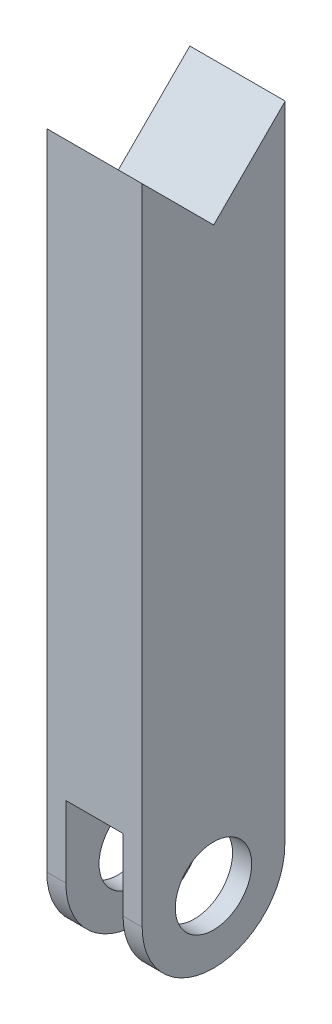
ISO-10303-21;
HEADER;
FILE_DESCRIPTION(('STEP AP214'),'2;1');
FILE_NAME('part.step','',(''),(''),'','','');
FILE_SCHEMA(('AUTOMOTIVE_DESIGN { 1 0 10303 214 1 1 1 1 }'));
ENDSEC;
DATA;
#1=APPLICATION_CONTEXT('core data for automotive mechanical design processes');
#2=APPLICATION_PROTOCOL_DEFINITION('international standard','automotive_design',2000,#1);
#3=PRODUCT_CONTEXT('',#1,'mechanical');
#4=PRODUCT('Part','Part','',(#3));
#5=PRODUCT_RELATED_PRODUCT_CATEGORY('part','',(#4));
#6=PRODUCT_DEFINITION_FORMATION('','',#4);
#7=PRODUCT_DEFINITION_CONTEXT('part definition',#1,'design');
#8=PRODUCT_DEFINITION('design','',#6,#7);
#9=PRODUCT_DEFINITION_SHAPE('','',#8);
#10=(LENGTH_UNIT() NAMED_UNIT(*) SI_UNIT(.MILLI.,.METRE.));
#11=(NAMED_UNIT(*) PLANE_ANGLE_UNIT() SI_UNIT($,.RADIAN.));
#12=(NAMED_UNIT(*) SI_UNIT($,.STERADIAN.) SOLID_ANGLE_UNIT());
#13=UNCERTAINTY_MEASURE_WITH_UNIT(LENGTH_MEASURE(1.E-05),#10,'distance_accuracy_value','');
#14=(GEOMETRIC_REPRESENTATION_CONTEXT(3) GLOBAL_UNCERTAINTY_ASSIGNED_CONTEXT((#13)) GLOBAL_UNIT_ASSIGNED_CONTEXT((#10,
#11,#12)) REPRESENTATION_CONTEXT('',''));
#15=CARTESIAN_POINT('',(0.,0.,0.));
#16=DIRECTION('',(0.,0.,1.));
#17=DIRECTION('',(1.,0.,0.));
#18=AXIS2_PLACEMENT_3D('',#15,#16,#17);
#19=CARTESIAN_POINT('',(100.,0.,0.));
#20=DIRECTION('',(-1.,0.,0.));
#21=DIRECTION('',(0.,0.,1.));
#22=AXIS2_PLACEMENT_3D('',#19,#20,#21);
#23=CYLINDRICAL_SURFACE('',#22,74.7678036336063);
#24=CARTESIAN_POINT('',(20.,0.,0.));
#25=DIRECTION('',(1.,0.,0.));
#26=DIRECTION('',(0.,0.,-1.));
#27=AXIS2_PLACEMENT_3D('',#24,#25,#26);
#28=CIRCLE('',#27,74.7678036336063);
#29=CARTESIAN_POINT('',(20.,0.,74.7678036336063));
#30=VERTEX_POINT('',#29);
#31=CARTESIAN_POINT('',(20.,0.,-74.7678036336063));
#32=VERTEX_POINT('',#31);
#33=EDGE_CURVE('E76',#30,#32,#28,.T.);
#34=ORIENTED_EDGE('',*,*,#33,.F.);
#35=DIRECTION('',(-1.,0.,0.));
#36=VECTOR('',#35,1.);
#37=CARTESIAN_POINT('',(100.,0.,74.7678036336063));
#38=LINE('',#37,#36);
#39=CARTESIAN_POINT('',(0.,0.,74.7678036336063));
#40=VERTEX_POINT('',#39);
#41=EDGE_CURVE('E72',#30,#40,#38,.T.);
#42=ORIENTED_EDGE('',*,*,#41,.T.);
#43=CARTESIAN_POINT('',(0.,0.,0.));
#44=DIRECTION('',(1.,0.,0.));
#45=DIRECTION('',(0.,0.,-1.));
#46=AXIS2_PLACEMENT_3D('',#43,#44,#45);
#47=CIRCLE('',#46,74.7678036336063);
#48=CARTESIAN_POINT('',(0.,0.,-74.7678036336063));
#49=VERTEX_POINT('',#48);
#50=EDGE_CURVE('E75',#40,#49,#47,.T.);
#51=ORIENTED_EDGE('',*,*,#50,.T.);
#52=DIRECTION('',(-1.,0.,0.));
#53=VECTOR('',#52,1.);
#54=CARTESIAN_POINT('',(100.,0.,-74.7678036336063));
#55=LINE('',#54,#53);
#56=EDGE_CURVE('E41',#32,#49,#55,.T.);
#57=ORIENTED_EDGE('',*,*,#56,.F.);
#58=EDGE_LOOP('',(#34,#42,#51,#57));
#59=FACE_BOUND('',#58,.T.);
#60=ADVANCED_FACE('F32',(#59),#23,.T.);
#61=CARTESIAN_POINT('',(285.,0.,0.));
#62=DIRECTION('',(-1.,0.,0.));
#63=DIRECTION('',(0.,0.,1.));
#64=AXIS2_PLACEMENT_3D('',#61,#62,#63);
#65=CYLINDRICAL_SURFACE('',#64,40.);
#66=CARTESIAN_POINT('',(0.,0.,0.));
#67=DIRECTION('',(-1.,0.,0.));
#68=DIRECTION('',(0.,0.,1.));
#69=AXIS2_PLACEMENT_3D('',#66,#67,#68);
#70=CIRCLE('',#69,40.);
#71=CARTESIAN_POINT('',(0.,0.,40.));
#72=VERTEX_POINT('',#71);
#73=EDGE_CURVE('E131',#72,#72,#70,.T.);
#74=ORIENTED_EDGE('',*,*,#73,.T.);
#75=EDGE_LOOP('',(#74));
#76=FACE_BOUND('',#75,.T.);
#77=CARTESIAN_POINT('',(20.,0.,0.));
#78=DIRECTION('',(1.,0.,0.));
#79=DIRECTION('',(0.,0.,-1.));
#80=AXIS2_PLACEMENT_3D('',#77,#78,#79);
#81=CIRCLE('',#80,40.);
#82=CARTESIAN_POINT('',(20.,0.,-40.));
#83=VERTEX_POINT('',#82);
#84=EDGE_CURVE('E103',#83,#83,#81,.F.);
#85=ORIENTED_EDGE('',*,*,#84,.F.);
#86=EDGE_LOOP('',(#85));
#87=FACE_BOUND('',#86,.T.);
#88=ADVANCED_FACE('F229',(#76,#87),#65,.F.);
#89=CARTESIAN_POINT('',(100.,0.,-74.7678036336063));
#90=DIRECTION('',(0.,0.,1.));
#91=DIRECTION('',(0.,-1.,0.));
#92=AXIS2_PLACEMENT_3D('',#89,#90,#91);
#93=PLANE('',#92);
#94=DIRECTION('',(-1.,0.,0.));
#95=VECTOR('',#94,1.);
#96=CARTESIAN_POINT('',(20.,524.999999999999,-74.7678036336063));
#97=LINE('',#96,#95);
#98=CARTESIAN_POINT('',(100.,525.,-74.7678036336063));
#99=VERTEX_POINT('',#98);
#100=CARTESIAN_POINT('',(1.38777878078145E-13,525.,-74.7678036336063));
#101=VERTEX_POINT('',#100);
#102=EDGE_CURVE('E91',#99,#101,#97,.T.);
#103=ORIENTED_EDGE('',*,*,#102,.F.);
#104=DIRECTION('',(0.,1.,0.));
#105=VECTOR('',#104,1.);
#106=CARTESIAN_POINT('',(100.,0.,-74.7678036336063));
#107=LINE('',#106,#105);
#108=CARTESIAN_POINT('',(100.,0.,-74.7678036336063));
#109=VERTEX_POINT('',#108);
#110=EDGE_CURVE('E100',#109,#99,#107,.T.);
#111=ORIENTED_EDGE('',*,*,#110,.F.);
#112=CARTESIAN_POINT('',(80.,0.,-74.7678036336063));
#113=VERTEX_POINT('',#112);
#114=EDGE_CURVE('E11',#109,#113,#55,.T.);
#115=ORIENTED_EDGE('',*,*,#114,.T.);
#116=DIRECTION('',(0.,1.,0.));
#117=VECTOR('',#116,1.);
#118=CARTESIAN_POINT('',(80.,0.,-74.7678036336063));
#119=LINE('',#118,#117);
#120=CARTESIAN_POINT('',(80.,75.,-74.7678036336063));
#121=VERTEX_POINT('',#120);
#122=EDGE_CURVE('E125',#113,#121,#119,.T.);
#123=ORIENTED_EDGE('',*,*,#122,.T.);
#124=DIRECTION('',(-1.,0.,0.));
#125=VECTOR('',#124,1.);
#126=CARTESIAN_POINT('',(100.,75.,-74.7678036336063));
#127=LINE('',#126,#125);
#128=CARTESIAN_POINT('',(20.,75.,-74.7678036336063));
#129=VERTEX_POINT('',#128);
#130=EDGE_CURVE('E128',#121,#129,#127,.T.);
#131=ORIENTED_EDGE('',*,*,#130,.T.);
#132=DIRECTION('',(0.,1.,0.));
#133=VECTOR('',#132,1.);
#134=CARTESIAN_POINT('',(20.,0.,-74.7678036336063));
#135=LINE('',#134,#133);
#136=EDGE_CURVE('E108',#32,#129,#135,.T.);
#137=ORIENTED_EDGE('',*,*,#136,.F.);
#138=ORIENTED_EDGE('',*,*,#56,.T.);
#139=DIRECTION('',(0.,1.,0.));
#140=VECTOR('',#139,1.);
#141=CARTESIAN_POINT('',(0.,0.,-74.7678036336063));
#142=LINE('',#141,#140);
#143=EDGE_CURVE('E90',#49,#101,#142,.T.);
#144=ORIENTED_EDGE('',*,*,#143,.T.);
#145=EDGE_LOOP('',(#103,#111,#115,#123,#131,#137,#138,#144));
#146=FACE_BOUND('',#145,.T.);
#147=ADVANCED_FACE('F198',(#146),#93,.F.);
#148=CARTESIAN_POINT('',(100.,0.,74.7678036336063));
#149=DIRECTION('',(0.,0.,1.));
#150=DIRECTION('',(1.,0.,0.));
#151=AXIS2_PLACEMENT_3D('',#148,#149,#150);
#152=PLANE('',#151);
#153=DIRECTION('',(0.,1.,0.));
#154=VECTOR('',#153,1.);
#155=CARTESIAN_POINT('',(100.,0.,74.7678036336063));
#156=LINE('',#155,#154);
#157=CARTESIAN_POINT('',(100.,0.,74.7678036336063));
#158=VERTEX_POINT('',#157);
#159=CARTESIAN_POINT('',(100.,675.,74.7678036336063));
#160=VERTEX_POINT('',#159);
#161=EDGE_CURVE('E78',#158,#160,#156,.T.);
#162=ORIENTED_EDGE('',*,*,#161,.T.);
#163=DIRECTION('',(1.,0.,0.));
#164=VECTOR('',#163,1.);
#165=CARTESIAN_POINT('',(1.38777878078145E-13,675.,74.7678036336063));
#166=LINE('',#165,#164);
#167=CARTESIAN_POINT('',(1.38777878078145E-13,675.,74.7678036336063));
#168=VERTEX_POINT('',#167);
#169=EDGE_CURVE('E95',#168,#160,#166,.T.);
#170=ORIENTED_EDGE('',*,*,#169,.F.);
#171=DIRECTION('',(0.,1.,0.));
#172=VECTOR('',#171,1.);
#173=CARTESIAN_POINT('',(0.,0.,74.7678036336063));
#174=LINE('',#173,#172);
#175=EDGE_CURVE('E86',#40,#168,#174,.T.);
#176=ORIENTED_EDGE('',*,*,#175,.F.);
#177=ORIENTED_EDGE('',*,*,#41,.F.);
#178=DIRECTION('',(0.,1.,0.));
#179=VECTOR('',#178,1.);
#180=CARTESIAN_POINT('',(20.,-75.,74.7678036336063));
#181=LINE('',#180,#179);
#182=CARTESIAN_POINT('',(20.,75.,74.7678036336063));
#183=VERTEX_POINT('',#182);
#184=EDGE_CURVE('E49',#30,#183,#181,.T.);
#185=ORIENTED_EDGE('',*,*,#184,.T.);
#186=DIRECTION('',(-1.,0.,0.));
#187=VECTOR('',#186,1.);
#188=CARTESIAN_POINT('',(80.,75.,74.7678036336063));
#189=LINE('',#188,#187);
#190=CARTESIAN_POINT('',(80.,75.,74.7678036336063));
#191=VERTEX_POINT('',#190);
#192=EDGE_CURVE('E177',#191,#183,#189,.T.);
#193=ORIENTED_EDGE('',*,*,#192,.F.);
#194=DIRECTION('',(0.,1.,0.));
#195=VECTOR('',#194,1.);
#196=CARTESIAN_POINT('',(80.,-75.,74.7678036336063));
#197=LINE('',#196,#195);
#198=CARTESIAN_POINT('',(80.,0.,74.7678036336063));
#199=VERTEX_POINT('',#198);
#200=EDGE_CURVE('E155',#199,#191,#197,.T.);
#201=ORIENTED_EDGE('',*,*,#200,.F.);
#202=EDGE_CURVE('E58',#158,#199,#38,.T.);
#203=ORIENTED_EDGE('',*,*,#202,.F.);
#204=EDGE_LOOP('',(#162,#170,#176,#177,#185,#193,#201,#203));
#205=FACE_BOUND('',#204,.T.);
#206=ADVANCED_FACE('F93',(#205),#152,.T.);
#207=CARTESIAN_POINT('',(100.,0.,0.));
#208=DIRECTION('',(1.,0.,0.));
#209=DIRECTION('',(0.,0.,-1.));
#210=AXIS2_PLACEMENT_3D('',#207,#208,#209);
#211=PLANE('',#210);
#212=CARTESIAN_POINT('',(100.,0.,0.));
#213=DIRECTION('',(1.,0.,0.));
#214=DIRECTION('',(0.,0.,-1.));
#215=AXIS2_PLACEMENT_3D('',#212,#213,#214);
#216=CIRCLE('',#215,40.);
#217=CARTESIAN_POINT('',(100.,0.,-40.));
#218=VERTEX_POINT('',#217);
#219=EDGE_CURVE('E134',#218,#218,#216,.T.);
#220=ORIENTED_EDGE('',*,*,#219,.F.);
#221=EDGE_LOOP('',(#220));
#222=FACE_BOUND('',#221,.T.);
#223=ORIENTED_EDGE('',*,*,#110,.T.);
#224=DIRECTION('',(0.,0.999995207576445,-0.00309593671480445));
#225=VECTOR('',#224,1.);
#226=CARTESIAN_POINT('',(100.,675.,-75.2321963663937));
#227=LINE('',#226,#225);
#228=CARTESIAN_POINT('',(100.,675.,-75.2321963663937));
#229=VERTEX_POINT('',#228);
#230=EDGE_CURVE('E167',#99,#229,#227,.T.);
#231=ORIENTED_EDGE('',*,*,#230,.T.);
#232=DIRECTION('',(0.,-0.707106781186548,0.707106781186547));
#233=VECTOR('',#232,1.);
#234=CARTESIAN_POINT('',(100.,600.,-0.232196366393655));
#235=LINE('',#234,#233);
#236=CARTESIAN_POINT('',(100.,600.,-0.232196366393655));
#237=VERTEX_POINT('',#236);
#238=EDGE_CURVE('E161',#229,#237,#235,.T.);
#239=ORIENTED_EDGE('',*,*,#238,.T.);
#240=DIRECTION('',(0.,0.707106781186547,0.707106781186548));
#241=VECTOR('',#240,1.);
#242=CARTESIAN_POINT('',(100.,675.,74.7678036336063));
#243=LINE('',#242,#241);
#244=EDGE_CURVE('E152',#237,#160,#243,.T.);
#245=ORIENTED_EDGE('',*,*,#244,.T.);
#246=ORIENTED_EDGE('',*,*,#161,.F.);
#247=CARTESIAN_POINT('',(100.,0.,0.));
#248=DIRECTION('',(1.,0.,0.));
#249=DIRECTION('',(0.,0.,-1.));
#250=AXIS2_PLACEMENT_3D('',#247,#248,#249);
#251=CIRCLE('',#250,74.7678036336063);
#252=EDGE_CURVE('E97',#158,#109,#251,.T.);
#253=ORIENTED_EDGE('',*,*,#252,.T.);
#254=EDGE_LOOP('',(#223,#231,#239,#245,#246,#253));
#255=FACE_BOUND('',#254,.T.);
#256=ADVANCED_FACE('F158',(#222,#255),#211,.T.);
#257=ORIENTED_EDGE('',*,*,#202,.T.);
#258=CARTESIAN_POINT('',(80.,0.,0.));
#259=DIRECTION('',(1.,0.,0.));
#260=DIRECTION('',(0.,0.,-1.));
#261=AXIS2_PLACEMENT_3D('',#258,#259,#260);
#262=CIRCLE('',#261,74.7678036336063);
#263=EDGE_CURVE('E122',#199,#113,#262,.T.);
#264=ORIENTED_EDGE('',*,*,#263,.T.);
#265=ORIENTED_EDGE('',*,*,#114,.F.);
#266=ORIENTED_EDGE('',*,*,#252,.F.);
#267=EDGE_LOOP('',(#257,#264,#265,#266));
#268=FACE_BOUND('',#267,.T.);
#269=ADVANCED_FACE('F34',(#268),#23,.T.);
#270=CARTESIAN_POINT('',(0.,0.,0.));
#271=DIRECTION('',(1.,0.,0.));
#272=DIRECTION('',(0.,0.,-1.));
#273=AXIS2_PLACEMENT_3D('',#270,#271,#272);
#274=PLANE('',#273);
#275=ORIENTED_EDGE('',*,*,#73,.F.);
#276=EDGE_LOOP('',(#275));
#277=FACE_BOUND('',#276,.T.);
#278=ORIENTED_EDGE('',*,*,#175,.T.);
#279=DIRECTION('',(0.,0.707106781186547,0.707106781186548));
#280=VECTOR('',#279,1.);
#281=CARTESIAN_POINT('',(1.38777878078145E-13,675.,74.7678036336063));
#282=LINE('',#281,#280);
#283=CARTESIAN_POINT('',(1.38777878078145E-13,600.,-0.232196366393655));
#284=VERTEX_POINT('',#283);
#285=EDGE_CURVE('E154',#284,#168,#282,.T.);
#286=ORIENTED_EDGE('',*,*,#285,.F.);
#287=DIRECTION('',(0.,-0.707106781186548,0.707106781186547));
#288=VECTOR('',#287,1.);
#289=CARTESIAN_POINT('',(1.38777878078145E-13,600.,-0.232196366393655));
#290=LINE('',#289,#288);
#291=CARTESIAN_POINT('',(1.38777878078145E-13,675.,-75.2321963663937));
#292=VERTEX_POINT('',#291);
#293=EDGE_CURVE('E165',#292,#284,#290,.T.);
#294=ORIENTED_EDGE('',*,*,#293,.F.);
#295=DIRECTION('',(0.,0.999995207576445,-0.00309593671480445));
#296=VECTOR('',#295,1.);
#297=CARTESIAN_POINT('',(1.38777878078145E-13,675.,-75.2321963663937));
#298=LINE('',#297,#296);
#299=EDGE_CURVE('E162',#101,#292,#298,.T.);
#300=ORIENTED_EDGE('',*,*,#299,.F.);
#301=ORIENTED_EDGE('',*,*,#143,.F.);
#302=ORIENTED_EDGE('',*,*,#50,.F.);
#303=EDGE_LOOP('',(#278,#286,#294,#300,#301,#302));
#304=FACE_BOUND('',#303,.T.);
#305=ADVANCED_FACE('F83',(#277,#304),#274,.F.);
#306=CARTESIAN_POINT('',(80.,0.,0.));
#307=DIRECTION('',(1.,0.,0.));
#308=DIRECTION('',(0.,0.,-1.));
#309=AXIS2_PLACEMENT_3D('',#306,#307,#308);
#310=CIRCLE('',#309,40.);
#311=CARTESIAN_POINT('',(80.,0.,-40.));
#312=VERTEX_POINT('',#311);
#313=EDGE_CURVE('E36',#312,#312,#310,.F.);
#314=ORIENTED_EDGE('',*,*,#313,.T.);
#315=EDGE_LOOP('',(#314));
#316=FACE_BOUND('',#315,.T.);
#317=ORIENTED_EDGE('',*,*,#219,.T.);
#318=EDGE_LOOP('',(#317));
#319=FACE_BOUND('',#318,.T.);
#320=ADVANCED_FACE('F235',(#316,#319),#65,.F.);
#321=CARTESIAN_POINT('',(80.,75.,-210.232196366394));
#322=DIRECTION('',(0.,1.,0.));
#323=DIRECTION('',(0.,0.,1.));
#324=AXIS2_PLACEMENT_3D('',#321,#322,#323);
#325=PLANE('',#324);
#326=DIRECTION('',(0.,0.,1.));
#327=VECTOR('',#326,1.);
#328=CARTESIAN_POINT('',(80.,75.,-210.232196366394));
#329=LINE('',#328,#327);
#330=EDGE_CURVE('E110',#121,#191,#329,.T.);
#331=ORIENTED_EDGE('',*,*,#330,.T.);
#332=ORIENTED_EDGE('',*,*,#192,.T.);
#333=DIRECTION('',(0.,0.,1.));
#334=VECTOR('',#333,1.);
#335=CARTESIAN_POINT('',(20.,75.,-210.232196366394));
#336=LINE('',#335,#334);
#337=EDGE_CURVE('E105',#129,#183,#336,.T.);
#338=ORIENTED_EDGE('',*,*,#337,.F.);
#339=ORIENTED_EDGE('',*,*,#130,.F.);
#340=EDGE_LOOP('',(#331,#332,#338,#339));
#341=FACE_BOUND('',#340,.T.);
#342=ADVANCED_FACE('F250',(#341),#325,.F.);
#343=CARTESIAN_POINT('',(80.,-75.,-210.232196366394));
#344=DIRECTION('',(1.,0.,0.));
#345=DIRECTION('',(0.,0.,-1.));
#346=AXIS2_PLACEMENT_3D('',#343,#344,#345);
#347=PLANE('',#346);
#348=ORIENTED_EDGE('',*,*,#313,.F.);
#349=EDGE_LOOP('',(#348));
#350=FACE_BOUND('',#349,.T.);
#351=ORIENTED_EDGE('',*,*,#263,.F.);
#352=ORIENTED_EDGE('',*,*,#200,.T.);
#353=ORIENTED_EDGE('',*,*,#330,.F.);
#354=ORIENTED_EDGE('',*,*,#122,.F.);
#355=EDGE_LOOP('',(#351,#352,#353,#354));
#356=FACE_BOUND('',#355,.T.);
#357=ADVANCED_FACE('F249',(#350,#356),#347,.F.);
#358=CARTESIAN_POINT('',(20.,-75.,-210.232196366394));
#359=DIRECTION('',(1.,0.,0.));
#360=DIRECTION('',(0.,0.,-1.));
#361=AXIS2_PLACEMENT_3D('',#358,#359,#360);
#362=PLANE('',#361);
#363=ORIENTED_EDGE('',*,*,#84,.T.);
#364=EDGE_LOOP('',(#363));
#365=FACE_BOUND('',#364,.T.);
#366=ORIENTED_EDGE('',*,*,#136,.T.);
#367=ORIENTED_EDGE('',*,*,#337,.T.);
#368=ORIENTED_EDGE('',*,*,#184,.F.);
#369=ORIENTED_EDGE('',*,*,#33,.T.);
#370=EDGE_LOOP('',(#366,#367,#368,#369));
#371=FACE_BOUND('',#370,.T.);
#372=ADVANCED_FACE('F226',(#365,#371),#362,.T.);
#373=CARTESIAN_POINT('',(1.38777878078145E-13,675.,74.7678036336063));
#374=DIRECTION('',(0.,0.707106781186548,-0.707106781186547));
#375=DIRECTION('',(0.,0.707106781186547,0.707106781186548));
#376=AXIS2_PLACEMENT_3D('',#373,#374,#375);
#377=PLANE('',#376);
#378=ORIENTED_EDGE('',*,*,#244,.F.);
#379=DIRECTION('',(1.,0.,0.));
#380=VECTOR('',#379,1.);
#381=CARTESIAN_POINT('',(1.38777878078145E-13,600.,-0.232196366393655));
#382=LINE('',#381,#380);
#383=EDGE_CURVE('E156',#284,#237,#382,.T.);
#384=ORIENTED_EDGE('',*,*,#383,.F.);
#385=ORIENTED_EDGE('',*,*,#285,.T.);
#386=ORIENTED_EDGE('',*,*,#169,.T.);
#387=EDGE_LOOP('',(#378,#384,#385,#386));
#388=FACE_BOUND('',#387,.T.);
#389=ADVANCED_FACE('F150',(#388),#377,.T.);
#390=CARTESIAN_POINT('',(1.38777878078145E-13,600.,-0.232196366393655));
#391=DIRECTION('',(0.,0.707106781186547,0.707106781186548));
#392=DIRECTION('',(0.,-0.707106781186548,0.707106781186547));
#393=AXIS2_PLACEMENT_3D('',#390,#391,#392);
#394=PLANE('',#393);
#395=ORIENTED_EDGE('',*,*,#238,.F.);
#396=DIRECTION('',(1.,0.,0.));
#397=VECTOR('',#396,1.);
#398=CARTESIAN_POINT('',(1.38777878078145E-13,675.,-75.2321963663937));
#399=LINE('',#398,#397);
#400=EDGE_CURVE('E173',#292,#229,#399,.T.);
#401=ORIENTED_EDGE('',*,*,#400,.F.);
#402=ORIENTED_EDGE('',*,*,#293,.T.);
#403=ORIENTED_EDGE('',*,*,#383,.T.);
#404=EDGE_LOOP('',(#395,#401,#402,#403));
#405=FACE_BOUND('',#404,.T.);
#406=ADVANCED_FACE('F211',(#405),#394,.T.);
#407=CARTESIAN_POINT('',(1.38777878078145E-13,675.,-75.2321963663937));
#408=DIRECTION('',(0.,-0.00309593671480445,-0.999995207576445));
#409=DIRECTION('',(0.,0.999995207576445,-0.00309593671480445));
#410=AXIS2_PLACEMENT_3D('',#407,#408,#409);
#411=PLANE('',#410);
#412=ORIENTED_EDGE('',*,*,#230,.F.);
#413=ORIENTED_EDGE('',*,*,#102,.T.);
#414=ORIENTED_EDGE('',*,*,#299,.T.);
#415=ORIENTED_EDGE('',*,*,#400,.T.);
#416=EDGE_LOOP('',(#412,#413,#414,#415));
#417=FACE_BOUND('',#416,.T.);
#418=ADVANCED_FACE('F203',(#417),#411,.T.);
#419=CLOSED_SHELL('',(#60,#88,#147,#206,#256,#269,#305,#320,#342,#357,#372,#389,#406,#418));
#420=MANIFOLD_SOLID_BREP('B2',#419);
#421=ADVANCED_BREP_SHAPE_REPRESENTATION('',(#18,#420),#14);
#422=SHAPE_DEFINITION_REPRESENTATION(#9,#421);
ENDSEC;
END-ISO-10303-21;
